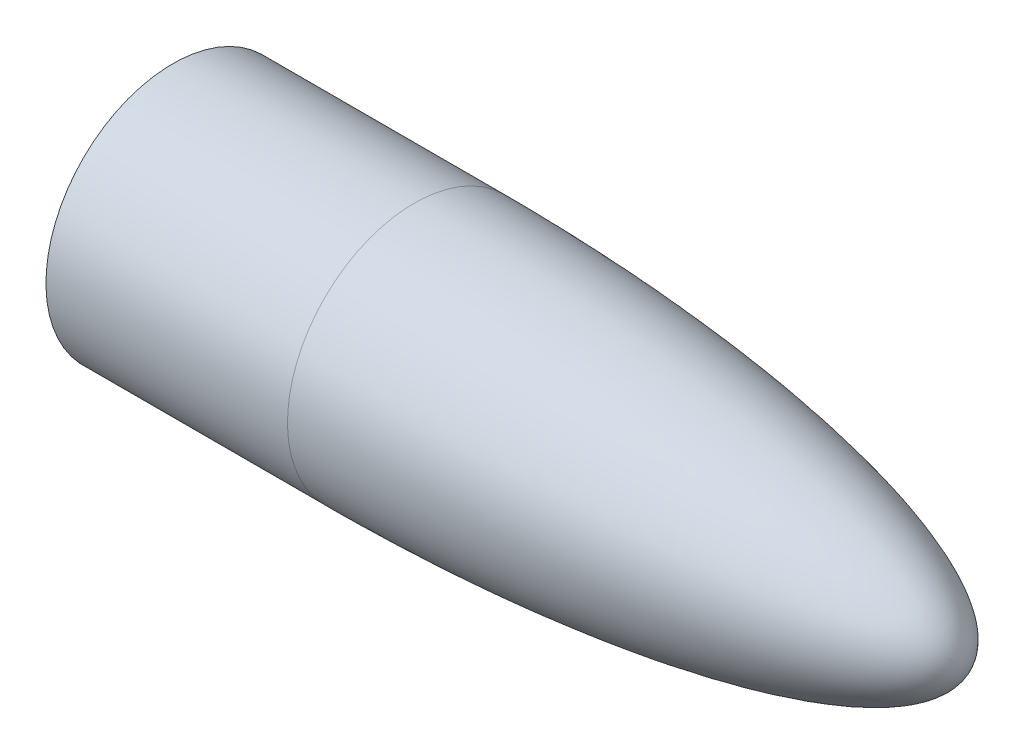
ISO-10303-21;
HEADER;
FILE_DESCRIPTION(('STEP AP214'),'2;1');
FILE_NAME('part.step','',(''),(''),'','','');
FILE_SCHEMA(('AUTOMOTIVE_DESIGN { 1 0 10303 214 1 1 1 1 }'));
ENDSEC;
DATA;
#1=APPLICATION_CONTEXT('core data for automotive mechanical design processes');
#2=APPLICATION_PROTOCOL_DEFINITION('international standard','automotive_design',2000,#1);
#3=PRODUCT_CONTEXT('',#1,'mechanical');
#4=PRODUCT('Part','Part','',(#3));
#5=PRODUCT_RELATED_PRODUCT_CATEGORY('part','',(#4));
#6=PRODUCT_DEFINITION_FORMATION('','',#4);
#7=PRODUCT_DEFINITION_CONTEXT('part definition',#1,'design');
#8=PRODUCT_DEFINITION('design','',#6,#7);
#9=PRODUCT_DEFINITION_SHAPE('','',#8);
#10=(LENGTH_UNIT() NAMED_UNIT(*) SI_UNIT(.MILLI.,.METRE.));
#11=(NAMED_UNIT(*) PLANE_ANGLE_UNIT() SI_UNIT($,.RADIAN.));
#12=(NAMED_UNIT(*) SI_UNIT($,.STERADIAN.) SOLID_ANGLE_UNIT());
#13=UNCERTAINTY_MEASURE_WITH_UNIT(LENGTH_MEASURE(1.E-05),#10,'distance_accuracy_value','');
#14=(GEOMETRIC_REPRESENTATION_CONTEXT(3) GLOBAL_UNCERTAINTY_ASSIGNED_CONTEXT((#13)) GLOBAL_UNIT_ASSIGNED_CONTEXT((#10,
#11,#12)) REPRESENTATION_CONTEXT('',''));
#15=CARTESIAN_POINT('',(0.,0.,0.));
#16=DIRECTION('',(0.,0.,1.));
#17=DIRECTION('',(1.,0.,0.));
#18=AXIS2_PLACEMENT_3D('',#15,#16,#17);
#19=CARTESIAN_POINT('',(115.27,0.,0.));
#20=DIRECTION('',(-1.,0.,0.));
#21=DIRECTION('',(0.,-1.,0.));
#22=AXIS2_PLACEMENT_3D('',#19,#20,#21);
#23=CONICAL_SURFACE('',#22,0.,1.56907062817349);
#24=CARTESIAN_POINT('',(115.269962080439,0.,0.));
#25=DIRECTION('',(-1.,0.,0.));
#26=DIRECTION('',(0.,-1.,0.));
#27=AXIS2_PLACEMENT_3D('',#24,#25,#26);
#28=CIRCLE('',#27,0.0219734332300089);
#29=CARTESIAN_POINT('',(115.269962080439,-0.0219734332300089,0.));
#30=VERTEX_POINT('',#29);
#31=EDGE_CURVE('E11',#30,#30,#28,.T.);
#32=ORIENTED_EDGE('',*,*,#31,.F.);
#33=EDGE_LOOP('',(#32));
#34=FACE_BOUND('',#33,.T.);
#35=CARTESIAN_POINT('',(115.27,0.,0.));
#36=VERTEX_POINT('',#35);
#37=VERTEX_LOOP('',#36);
#38=FACE_BOUND('',#37,.T.);
#39=ADVANCED_FACE('F33',(#34,#38),#23,.T.);
#40=CARTESIAN_POINT('',(115.269999978036,0.000236198555674702,0.));
#41=CARTESIAN_POINT('',(115.269998980463,0.00559997772892409,0.));
#42=CARTESIAN_POINT('',(115.269986632122,0.0147366921333167,0.));
#43=CARTESIAN_POINT('',(115.26745201566,0.784571551127472,0.));
#44=CARTESIAN_POINT('',(114.996921855444,2.31780726666978,0.));
#45=CARTESIAN_POINT('',(114.003600012461,4.28644292535536,0.));
#46=CARTESIAN_POINT('',(112.695237924667,5.94257767711682,0.));
#47=CARTESIAN_POINT('',(110.722819960683,7.81909749992115,0.));
#48=CARTESIAN_POINT('',(108.012975591876,9.71839096359762,0.));
#49=CARTESIAN_POINT('',(104.59195645736,11.581795339594,0.));
#50=CARTESIAN_POINT('',(101.07229532489,13.1652317416399,0.));
#51=CARTESIAN_POINT('',(96.297029239748,15.0056383705861,0.));
#52=CARTESIAN_POINT('',(90.2239424016812,16.919680073304,0.));
#53=CARTESIAN_POINT('',(82.8464505212083,18.80618296853,0.));
#54=CARTESIAN_POINT('',(75.4115508799585,20.3846402872968,0.));
#55=CARTESIAN_POINT('',(67.9380409422418,21.7187470925705,0.));
#56=CARTESIAN_POINT('',(57.9364556016088,23.2252759407026,0.));
#57=CARTESIAN_POINT('',(45.3848171293994,24.6708018380227,0.));
#58=CARTESIAN_POINT('',(32.7940464445654,25.64735633071,0.));
#59=CARTESIAN_POINT('',(22.7121152284735,26.1819125898385,0.));
#60=CARTESIAN_POINT('',(16.3994709025091,26.4174622416213,0.));
#61=CARTESIAN_POINT('',(11.9916356918876,26.5322793424939,0.));
#62=CARTESIAN_POINT('',(9.45811854173913,26.5836953829856,0.));
#63=CARTESIAN_POINT('',(7.5887301110136,26.6152262148247,0.));
#64=CARTESIAN_POINT('',(5.6474241381544,26.6397078066223,0.));
#65=CARTESIAN_POINT('',(4.13693646699108,26.6542753788592,0.));
#66=CARTESIAN_POINT('',(2.84034306378994,26.6624327511872,0.));
#67=CARTESIAN_POINT('',(1.83190467618562,26.6667981888002,0.));
#68=CARTESIAN_POINT('',(0.868983226954742,26.6694174099649,0.));
#69=CARTESIAN_POINT('',(0.295354457803039,26.6699999999993,0.));
#70=CARTESIAN_POINT('',(0.,26.6699999999993,0.));
#71=B_SPLINE_CURVE_WITH_KNOTS('',3,(#40,#41,#42,#43,#44,#45,#46,#47,#48,#49,#50,#51,#52,#53,#54,
#55,#56,#57,#58,#59,#60,#61,#62,#63,#64,#65,#66,#67,#68,#69,#70),.UNSPECIFIED.,.F.,.F.,(4,1,1,1,
1,1,1,1,1,1,1,1,1,1,1,1,1,1,1,1,1,1,1,1,1,1,1,1,4),(0.0862040772612812,0.0863047663355773,
0.0863718923851081,0.100482138554074,0.114760199846866,0.129038261139659,0.143316322432451,
0.171872445018036,0.200428567603621,0.228984690189206,0.257540812774791,0.314653057945961,
0.371765303117131,0.428877548288301,0.485989793459471,0.543102038630641,0.65732652897298,
0.77155101931532,0.82866326448649,0.88577550965766,0.914331632243245,0.928609693536038,
0.94288775482883,0.957165816121623,0.971443877414415,0.978582908060811,0.985721938707207,
0.992860969353604,1.),.UNSPECIFIED.);
#72=CARTESIAN_POINT('',(-36.6063000589223,0.,0.));
#73=DIRECTION('',(-1.,0.,0.));
#74=AXIS1_PLACEMENT('',#72,#73);
#75=SURFACE_OF_REVOLUTION('',#71,#74);
#76=CARTESIAN_POINT('',(0.,0.,0.));
#77=DIRECTION('',(-1.,0.,0.));
#78=DIRECTION('',(0.,-1.,0.));
#79=AXIS2_PLACEMENT_3D('',#76,#77,#78);
#80=CIRCLE('',#79,26.6699999999993);
#81=CARTESIAN_POINT('',(0.,-26.6699999999993,0.));
#82=VERTEX_POINT('',#81);
#83=EDGE_CURVE('E40',#82,#82,#80,.T.);
#84=ORIENTED_EDGE('',*,*,#83,.F.);
#85=EDGE_LOOP('',(#84));
#86=FACE_BOUND('',#85,.T.);
#87=ORIENTED_EDGE('',*,*,#31,.T.);
#88=EDGE_LOOP('',(#87));
#89=FACE_BOUND('',#88,.T.);
#90=ADVANCED_FACE('F72',(#86,#89),#75,.T.);
#91=CARTESIAN_POINT('',(-36.6063000589223,0.,0.));
#92=DIRECTION('',(-1.,0.,0.));
#93=DIRECTION('',(0.,-1.,0.));
#94=AXIS2_PLACEMENT_3D('',#91,#92,#93);
#95=CYLINDRICAL_SURFACE('',#94,26.67);
#96=CARTESIAN_POINT('',(-50.8,0.,0.));
#97=DIRECTION('',(-1.,0.,0.));
#98=DIRECTION('',(0.,-1.,0.));
#99=AXIS2_PLACEMENT_3D('',#96,#97,#98);
#100=CIRCLE('',#99,26.6700000000006);
#101=CARTESIAN_POINT('',(-50.8,-26.6700000000006,0.));
#102=VERTEX_POINT('',#101);
#103=EDGE_CURVE('E58',#102,#102,#100,.T.);
#104=ORIENTED_EDGE('',*,*,#103,.F.);
#105=EDGE_LOOP('',(#104));
#106=FACE_BOUND('',#105,.T.);
#107=ORIENTED_EDGE('',*,*,#83,.T.);
#108=EDGE_LOOP('',(#107));
#109=FACE_BOUND('',#108,.T.);
#110=ADVANCED_FACE('F70',(#106,#109),#95,.T.);
#111=CARTESIAN_POINT('',(-50.8,25.4000000000006,0.));
#112=DIRECTION('',(1.,0.,0.));
#113=DIRECTION('',(0.,1.,0.));
#114=AXIS2_PLACEMENT_3D('',#111,#112,#113);
#115=PLANE('',#114);
#116=CARTESIAN_POINT('',(-50.8,0.,0.));
#117=DIRECTION('',(-1.,0.,0.));
#118=DIRECTION('',(0.,-1.,0.));
#119=AXIS2_PLACEMENT_3D('',#116,#117,#118);
#120=CIRCLE('',#119,25.4000000000006);
#121=CARTESIAN_POINT('',(-50.8,-25.4000000000006,0.));
#122=VERTEX_POINT('',#121);
#123=EDGE_CURVE('E55',#122,#122,#120,.T.);
#124=ORIENTED_EDGE('',*,*,#123,.F.);
#125=EDGE_LOOP('',(#124));
#126=FACE_BOUND('',#125,.T.);
#127=ORIENTED_EDGE('',*,*,#103,.T.);
#128=EDGE_LOOP('',(#127));
#129=FACE_BOUND('',#128,.T.);
#130=ADVANCED_FACE('F90',(#126,#129),#115,.F.);
#131=CARTESIAN_POINT('',(-36.6063000589223,0.,0.));
#132=DIRECTION('',(-1.,0.,0.));
#133=DIRECTION('',(0.,-1.,0.));
#134=AXIS2_PLACEMENT_3D('',#131,#132,#133);
#135=CYLINDRICAL_SURFACE('',#134,25.4);
#136=CARTESIAN_POINT('',(2.94387431098997E-09,0.,0.));
#137=DIRECTION('',(-1.,0.,0.));
#138=DIRECTION('',(0.,-1.,0.));
#139=AXIS2_PLACEMENT_3D('',#136,#137,#138);
#140=CIRCLE('',#139,25.3999999999993);
#141=CARTESIAN_POINT('',(2.94387431098997E-09,-25.3999999999993,0.));
#142=VERTEX_POINT('',#141);
#143=EDGE_CURVE('E53',#142,#142,#140,.T.);
#144=ORIENTED_EDGE('',*,*,#143,.F.);
#145=EDGE_LOOP('',(#144));
#146=FACE_BOUND('',#145,.T.);
#147=ORIENTED_EDGE('',*,*,#123,.T.);
#148=EDGE_LOOP('',(#147));
#149=FACE_BOUND('',#148,.T.);
#150=ADVANCED_FACE('F49',(#146,#149),#135,.F.);
#151=CARTESIAN_POINT('',(2.94387528677192E-09,25.3999999999993,0.));
#152=CARTESIAN_POINT('',(0.492694480324408,25.3999999999966,0.));
#153=CARTESIAN_POINT('',(1.49009807650714,25.3984848718551,0.));
#154=CARTESIAN_POINT('',(3.33833988878462,25.3916667908557,0.));
#155=CARTESIAN_POINT('',(5.3350779375849,25.3734761100878,0.));
#156=CARTESIAN_POINT('',(7.58090853756332,25.3461672899263,0.));
#157=CARTESIAN_POINT('',(9.68551042867967,25.3097126797993,0.));
#158=CARTESIAN_POINT('',(11.8714526213202,25.2640755625941,0.));
#159=CARTESIAN_POINT('',(14.0116328340126,25.2092090799295,0.));
#160=CARTESIAN_POINT('',(16.7145896665696,25.1290195317361,0.));
#161=CARTESIAN_POINT('',(19.9424943626382,25.014087620322,0.));
#162=CARTESIAN_POINT('',(23.7165324990403,24.8523890188004,0.));
#163=CARTESIAN_POINT('',(28.0222524681997,24.6289293804092,0.));
#164=CARTESIAN_POINT('',(32.3287807764651,24.3658261319041,0.));
#165=CARTESIAN_POINT('',(36.6308573745029,24.0618703675735,0.));
#166=CARTESIAN_POINT('',(40.9307813010857,23.715620310453,0.));
#167=CARTESIAN_POINT('',(45.2263398776555,23.3253271688831,0.));
#168=CARTESIAN_POINT('',(50.5906482351164,22.7798475763269,0.));
#169=CARTESIAN_POINT('',(55.9460543637421,22.1533907744826,0.));
#170=CARTESIAN_POINT('',(61.290642422166,21.4386888909595,0.));
#171=CARTESIAN_POINT('',(67.6868488612259,20.4624398885181,0.));
#172=CARTESIAN_POINT('',(72.9998576555644,19.5413346245834,0.));
#173=CARTESIAN_POINT('',(78.2902307749475,18.4967278890302,0.));
#174=CARTESIAN_POINT('',(84.6005662766179,17.0650703360057,0.));
#175=CARTESIAN_POINT('',(90.3027047737709,15.5736415247375,0.));
#176=CARTESIAN_POINT('',(95.9329003653974,13.8205280136588,0.));
#177=CARTESIAN_POINT('',(101.217440056744,11.7654947124258,0.));
#178=CARTESIAN_POINT('',(104.964602480632,9.97480476856201,0.));
#179=CARTESIAN_POINT('',(107.603951185156,8.44517270004701,0.));
#180=CARTESIAN_POINT('',(109.523381846116,7.09625236110558,0.));
#181=CARTESIAN_POINT('',(110.883463267111,5.9396023722079,0.));
#182=CARTESIAN_POINT('',(111.852292617442,4.94392611421397,0.));
#183=CARTESIAN_POINT('',(112.562293701403,4.05706121379434,0.));
#184=CARTESIAN_POINT('',(113.081208046786,3.25692444542977,0.));
#185=CARTESIAN_POINT('',(113.460924161403,2.5112538084132,0.));
#186=CARTESIAN_POINT('',(113.726436917831,1.81085023543621,0.));
#187=CARTESIAN_POINT('',(113.910279085636,1.10357317263883,0.));
#188=CARTESIAN_POINT('',(113.982356417127,0.569281783454566,0.));
#189=CARTESIAN_POINT('',(113.999961621329,0.206370754930778,0.));
#190=CARTESIAN_POINT('',(114.000000002805,-6.24635916297631E-10,0.));
#191=B_SPLINE_CURVE_WITH_KNOTS('',4,(#151,#152,#153,#154,#155,#156,#157,#158,#159,#160,#161,
#162,#163,#164,#165,#166,#167,#168,#169,#170,#171,#172,#173,#174,#175,#176,#177,#178,#179,#180,
#181,#182,#183,#184,#185,#186,#187,#188,#189,#190),.UNSPECIFIED.,.F.,.F.,(5,1,1,1,1,1,1,1,1,1,1,
1,1,1,1,1,1,1,1,1,1,1,1,1,1,1,1,1,1,1,1,1,1,1,1,1,5),(0.0862040772590667,0.102511122728817,
0.118818168171994,0.13512521361517,0.151432259058347,0.167739304597458,0.184046350136569,
0.20035339567568,0.21666044121479,0.249274532056223,0.281888622897656,0.314502713469664,
0.347116804041671,0.37973089496965,0.412344985897628,0.444959076689294,0.477573167480959,
0.542801347273291,0.575415438641696,0.608029530010102,0.673257705850226,0.705871797860664,
0.738485889871102,0.803714041687182,0.851475927743253,0.88409003104622,0.909828041103206,
0.929203956790992,0.943631646783723,0.954949691453983,0.963750033448748,0.971157964242047,
0.977938717516749,0.983743417452435,0.989009737414501,0.993767868894192,1.),.UNSPECIFIED.);
#192=CARTESIAN_POINT('',(-36.6063000589223,0.,0.));
#193=DIRECTION('',(-1.,0.,0.));
#194=AXIS1_PLACEMENT('',#192,#193);
#195=SURFACE_OF_REVOLUTION('',#191,#194);
#196=CARTESIAN_POINT('',(114.,0.,0.));
#197=VERTEX_POINT('',#196);
#198=VERTEX_LOOP('',#197);
#199=FACE_BOUND('',#198,.T.);
#200=ORIENTED_EDGE('',*,*,#143,.T.);
#201=EDGE_LOOP('',(#200));
#202=FACE_BOUND('',#201,.T.);
#203=ADVANCED_FACE('F46',(#199,#202),#195,.T.);
#204=CLOSED_SHELL('',(#39,#90,#110,#130,#150,#203));
#205=MANIFOLD_SOLID_BREP('B2',#204);
#206=ADVANCED_BREP_SHAPE_REPRESENTATION('',(#18,#205),#14);
#207=SHAPE_DEFINITION_REPRESENTATION(#9,#206);
ENDSEC;
END-ISO-10303-21;
